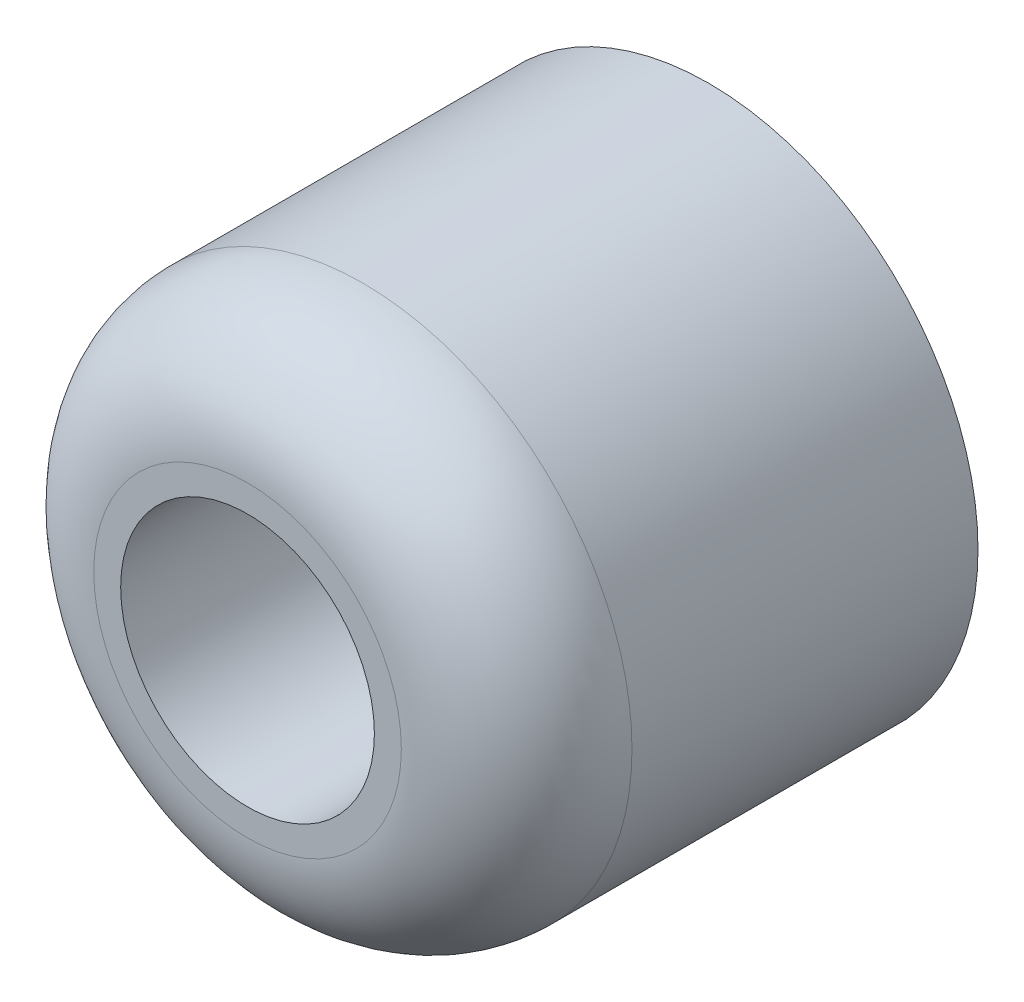
ISO-10303-21;
HEADER;
FILE_DESCRIPTION(('STEP AP214'),'2;1');
FILE_NAME('part.step','',(''),(''),'','','');
FILE_SCHEMA(('AUTOMOTIVE_DESIGN { 1 0 10303 214 1 1 1 1 }'));
ENDSEC;
DATA;
#1=APPLICATION_CONTEXT('core data for automotive mechanical design processes');
#2=APPLICATION_PROTOCOL_DEFINITION('international standard','automotive_design',2000,#1);
#3=PRODUCT_CONTEXT('',#1,'mechanical');
#4=PRODUCT('Part','Part','',(#3));
#5=PRODUCT_RELATED_PRODUCT_CATEGORY('part','',(#4));
#6=PRODUCT_DEFINITION_FORMATION('','',#4);
#7=PRODUCT_DEFINITION_CONTEXT('part definition',#1,'design');
#8=PRODUCT_DEFINITION('design','',#6,#7);
#9=PRODUCT_DEFINITION_SHAPE('','',#8);
#10=(LENGTH_UNIT() NAMED_UNIT(*) SI_UNIT(.MILLI.,.METRE.));
#11=(NAMED_UNIT(*) PLANE_ANGLE_UNIT() SI_UNIT($,.RADIAN.));
#12=(NAMED_UNIT(*) SI_UNIT($,.STERADIAN.) SOLID_ANGLE_UNIT());
#13=UNCERTAINTY_MEASURE_WITH_UNIT(LENGTH_MEASURE(1.E-05),#10,'distance_accuracy_value','');
#14=(GEOMETRIC_REPRESENTATION_CONTEXT(3) GLOBAL_UNCERTAINTY_ASSIGNED_CONTEXT((#13)) GLOBAL_UNIT_ASSIGNED_CONTEXT((#10,
#11,#12)) REPRESENTATION_CONTEXT('',''));
#15=CARTESIAN_POINT('',(0.,0.,0.));
#16=DIRECTION('',(0.,0.,1.));
#17=DIRECTION('',(1.,0.,0.));
#18=AXIS2_PLACEMENT_3D('',#15,#16,#17);
#19=CARTESIAN_POINT('',(0.,0.,6.));
#20=DIRECTION('',(0.,0.,1.));
#21=DIRECTION('',(1.,0.,0.));
#22=AXIS2_PLACEMENT_3D('',#19,#20,#21);
#23=PLANE('',#22);
#24=CARTESIAN_POINT('',(0.,0.,6.));
#25=DIRECTION('',(0.,0.,1.));
#26=DIRECTION('',(1.,0.,0.));
#27=AXIS2_PLACEMENT_3D('',#24,#25,#26);
#28=CIRCLE('',#27,2.);
#29=CARTESIAN_POINT('',(2.,0.,6.));
#30=VERTEX_POINT('',#29);
#31=EDGE_CURVE('E38',#30,#30,#28,.T.);
#32=ORIENTED_EDGE('',*,*,#31,.T.);
#33=EDGE_LOOP('',(#32));
#34=FACE_BOUND('',#33,.T.);
#35=CARTESIAN_POINT('',(0.,0.,6.));
#36=DIRECTION('',(0.,0.,1.));
#37=DIRECTION('',(1.,0.,0.));
#38=AXIS2_PLACEMENT_3D('',#35,#36,#37);
#39=CIRCLE('',#38,1.65);
#40=CARTESIAN_POINT('',(1.65,0.,6.));
#41=VERTEX_POINT('',#40);
#42=EDGE_CURVE('E46',#41,#41,#39,.T.);
#43=ORIENTED_EDGE('',*,*,#42,.F.);
#44=EDGE_LOOP('',(#43));
#45=FACE_BOUND('',#44,.T.);
#46=ADVANCED_FACE('F31',(#34,#45),#23,.T.);
#47=CARTESIAN_POINT('',(0.,0.,0.));
#48=DIRECTION('',(0.,0.,1.));
#49=DIRECTION('',(1.,0.,0.));
#50=AXIS2_PLACEMENT_3D('',#47,#48,#49);
#51=PLANE('',#50);
#52=CARTESIAN_POINT('',(0.,0.,0.));
#53=DIRECTION('',(0.,0.,1.));
#54=DIRECTION('',(1.,0.,0.));
#55=AXIS2_PLACEMENT_3D('',#52,#53,#54);
#56=CIRCLE('',#55,3.5);
#57=CARTESIAN_POINT('',(3.5,0.,0.));
#58=VERTEX_POINT('',#57);
#59=EDGE_CURVE('E42',#58,#58,#56,.T.);
#60=ORIENTED_EDGE('',*,*,#59,.F.);
#61=EDGE_LOOP('',(#60));
#62=FACE_BOUND('',#61,.T.);
#63=CARTESIAN_POINT('',(0.,0.,0.));
#64=DIRECTION('',(0.,0.,1.));
#65=DIRECTION('',(1.,0.,0.));
#66=AXIS2_PLACEMENT_3D('',#63,#64,#65);
#67=CIRCLE('',#66,1.65);
#68=CARTESIAN_POINT('',(1.65,0.,0.));
#69=VERTEX_POINT('',#68);
#70=EDGE_CURVE('E49',#69,#69,#67,.T.);
#71=ORIENTED_EDGE('',*,*,#70,.T.);
#72=EDGE_LOOP('',(#71));
#73=FACE_BOUND('',#72,.T.);
#74=ADVANCED_FACE('F59',(#62,#73),#51,.F.);
#75=CARTESIAN_POINT('',(0.,0.,6.));
#76=DIRECTION('',(0.,0.,-1.));
#77=DIRECTION('',(-1.,0.,0.));
#78=AXIS2_PLACEMENT_3D('',#75,#76,#77);
#79=CYLINDRICAL_SURFACE('',#78,3.5);
#80=CARTESIAN_POINT('',(0.,0.,4.5));
#81=DIRECTION('',(0.,0.,1.));
#82=DIRECTION('',(1.,0.,0.));
#83=AXIS2_PLACEMENT_3D('',#80,#81,#82);
#84=CIRCLE('',#83,3.5);
#85=CARTESIAN_POINT('',(3.5,0.,4.5));
#86=VERTEX_POINT('',#85);
#87=EDGE_CURVE('E10',#86,#86,#84,.F.);
#88=ORIENTED_EDGE('',*,*,#87,.T.);
#89=EDGE_LOOP('',(#88));
#90=FACE_BOUND('',#89,.T.);
#91=ORIENTED_EDGE('',*,*,#59,.T.);
#92=EDGE_LOOP('',(#91));
#93=FACE_BOUND('',#92,.T.);
#94=ADVANCED_FACE('F64',(#90,#93),#79,.T.);
#95=CARTESIAN_POINT('',(0.,0.,6.));
#96=DIRECTION('',(0.,0.,-1.));
#97=DIRECTION('',(-1.,0.,0.));
#98=AXIS2_PLACEMENT_3D('',#95,#96,#97);
#99=CYLINDRICAL_SURFACE('',#98,1.65);
#100=ORIENTED_EDGE('',*,*,#42,.T.);
#101=EDGE_LOOP('',(#100));
#102=FACE_BOUND('',#101,.T.);
#103=ORIENTED_EDGE('',*,*,#70,.F.);
#104=EDGE_LOOP('',(#103));
#105=FACE_BOUND('',#104,.T.);
#106=ADVANCED_FACE('F55',(#102,#105),#99,.F.);
#107=CARTESIAN_POINT('',(0.,0.,4.5));
#108=DIRECTION('',(0.,0.,1.));
#109=DIRECTION('',(1.,0.,0.));
#110=AXIS2_PLACEMENT_3D('',#107,#108,#109);
#111=TOROIDAL_SURFACE('',#110,2.,1.5);
#112=ORIENTED_EDGE('',*,*,#87,.F.);
#113=EDGE_LOOP('',(#112));
#114=FACE_BOUND('',#113,.T.);
#115=ORIENTED_EDGE('',*,*,#31,.F.);
#116=EDGE_LOOP('',(#115));
#117=FACE_BOUND('',#116,.T.);
#118=ADVANCED_FACE('F33',(#114,#117),#111,.T.);
#119=CLOSED_SHELL('',(#46,#74,#94,#106,#118));
#120=MANIFOLD_SOLID_BREP('B2',#119);
#121=ADVANCED_BREP_SHAPE_REPRESENTATION('',(#18,#120),#14);
#122=SHAPE_DEFINITION_REPRESENTATION(#9,#121);
ENDSEC;
END-ISO-10303-21;
